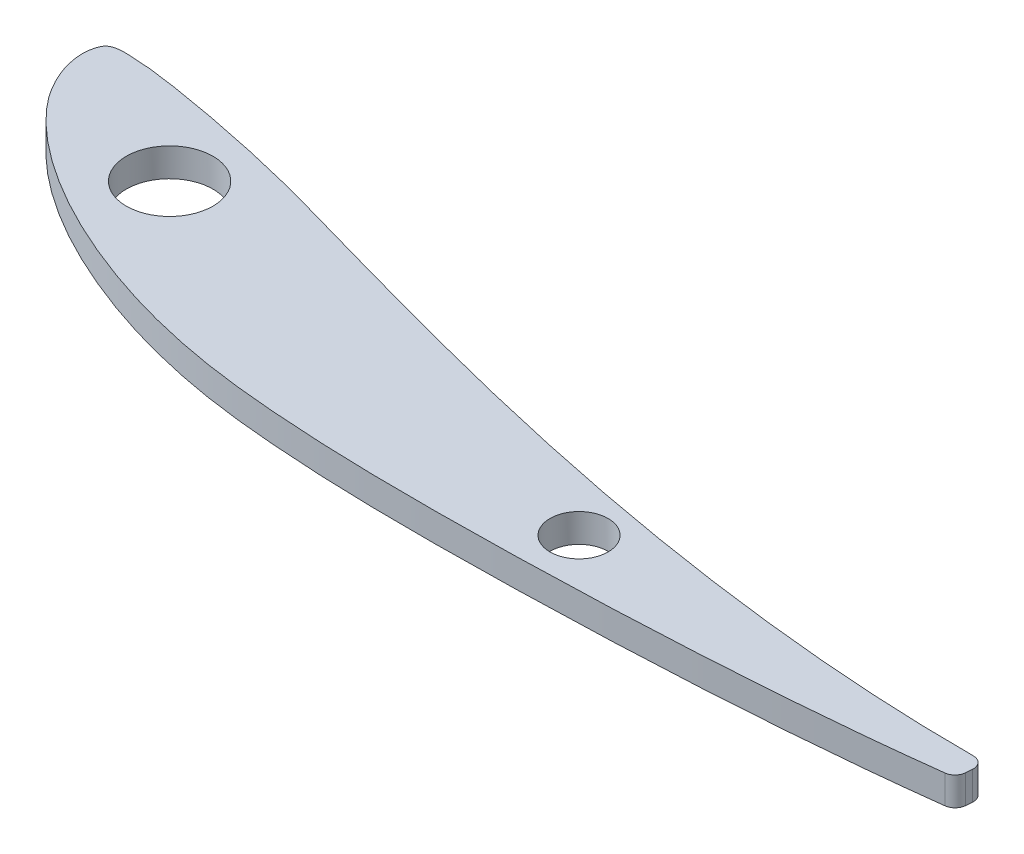
ISO-10303-21;
HEADER;
FILE_DESCRIPTION(('STEP AP214'),'2;1');
FILE_NAME('part.step','',(''),(''),'','','');
FILE_SCHEMA(('AUTOMOTIVE_DESIGN { 1 0 10303 214 1 1 1 1 }'));
ENDSEC;
DATA;
#1=APPLICATION_CONTEXT('core data for automotive mechanical design processes');
#2=APPLICATION_PROTOCOL_DEFINITION('international standard','automotive_design',2000,#1);
#3=PRODUCT_CONTEXT('',#1,'mechanical');
#4=PRODUCT('Part','Part','',(#3));
#5=PRODUCT_RELATED_PRODUCT_CATEGORY('part','',(#4));
#6=PRODUCT_DEFINITION_FORMATION('','',#4);
#7=PRODUCT_DEFINITION_CONTEXT('part definition',#1,'design');
#8=PRODUCT_DEFINITION('design','',#6,#7);
#9=PRODUCT_DEFINITION_SHAPE('','',#8);
#10=(LENGTH_UNIT() NAMED_UNIT(*) SI_UNIT(.MILLI.,.METRE.));
#11=(NAMED_UNIT(*) PLANE_ANGLE_UNIT() SI_UNIT($,.RADIAN.));
#12=(NAMED_UNIT(*) SI_UNIT($,.STERADIAN.) SOLID_ANGLE_UNIT());
#13=UNCERTAINTY_MEASURE_WITH_UNIT(LENGTH_MEASURE(1.E-05),#10,'distance_accuracy_value','');
#14=(GEOMETRIC_REPRESENTATION_CONTEXT(3) GLOBAL_UNCERTAINTY_ASSIGNED_CONTEXT((#13)) GLOBAL_UNIT_ASSIGNED_CONTEXT((#10,
#11,#12)) REPRESENTATION_CONTEXT('',''));
#15=CARTESIAN_POINT('',(0.,0.,0.));
#16=DIRECTION('',(0.,0.,1.));
#17=DIRECTION('',(1.,0.,0.));
#18=AXIS2_PLACEMENT_3D('',#15,#16,#17);
#19=CARTESIAN_POINT('',(298.857811710705,-3.175,26.1466705308497));
#20=CARTESIAN_POINT('',(298.856662639227,-3.175,26.1387486127703));
#21=CARTESIAN_POINT('',(297.633641763924,-3.175,26.8219907764441));
#22=CARTESIAN_POINT('',(296.285509348852,-3.175,27.4848303285165));
#23=CARTESIAN_POINT('',(292.777465742433,-3.175,29.1955452424968));
#24=CARTESIAN_POINT('',(288.067262994317,-3.175,30.965858612294));
#25=CARTESIAN_POINT('',(281.523729362366,-3.175,32.7786639593878));
#26=CARTESIAN_POINT('',(273.586904679442,-3.175,34.3198196124686));
#27=CARTESIAN_POINT('',(264.347464534687,-3.175,35.6013061847425));
#28=CARTESIAN_POINT('',(253.981328037305,-3.175,36.5347789245492));
#29=CARTESIAN_POINT('',(242.613491300924,-3.175,37.0696136369673));
#30=CARTESIAN_POINT('',(230.394070318636,-3.175,37.1746289440018));
#31=CARTESIAN_POINT('',(217.471223612421,-3.175,36.817831575187));
#32=CARTESIAN_POINT('',(204.00040499071,-3.175,36.0028417205393));
#33=CARTESIAN_POINT('',(190.136234506896,-3.175,34.734731771219));
#34=CARTESIAN_POINT('',(176.033094201207,-3.175,33.0310289768294));
#35=CARTESIAN_POINT('',(161.842177889675,-3.175,30.9308773504015));
#36=CARTESIAN_POINT('',(147.709569870829,-3.175,28.4811699518312));
#37=CARTESIAN_POINT('',(133.775408695098,-3.175,25.7258340138646));
#38=CARTESIAN_POINT('',(120.166596154891,-3.175,22.7451125567506));
#39=CARTESIAN_POINT('',(107.002388597573,-3.175,19.6016587809557));
#40=CARTESIAN_POINT('',(94.3913890188312,-3.175,16.3781680679727));
#41=CARTESIAN_POINT('',(82.426724302167,-3.175,13.153699812273));
#42=CARTESIAN_POINT('',(71.1905675935346,-3.175,10.0172968631099));
#43=CARTESIAN_POINT('',(60.7469216680835,-3.175,7.06407770107094));
#44=CARTESIAN_POINT('',(51.1432282225789,-3.175,4.34985818630684));
#45=CARTESIAN_POINT('',(42.3121182332758,-3.175,2.08320161733037));
#46=CARTESIAN_POINT('',(34.2060105984926,-3.175,0.305666429048975));
#47=CARTESIAN_POINT('',(26.845350388862,-3.175,-1.1710387440897));
#48=CARTESIAN_POINT('',(20.2679325078176,-3.175,-2.36154408345908));
#49=CARTESIAN_POINT('',(14.5403990580808,-3.175,-3.24605787013261));
#50=CARTESIAN_POINT('',(9.7317270132722,-3.175,-3.87481671702589));
#51=CARTESIAN_POINT('',(5.88176139509885,-3.175,-4.07429049382323));
#52=CARTESIAN_POINT('',(3.06391313462618,-3.175,-4.17950180857045));
#53=CARTESIAN_POINT('',(0.890615184890498,-3.175,-3.36857270625188));
#54=CARTESIAN_POINT('',(0.154946107578894,-3.175,-1.41757276692397));
#55=CARTESIAN_POINT('',(-0.130342445316775,-3.175,0.754680535623404));
#56=CARTESIAN_POINT('',(0.138551362685966,-3.175,3.37590152826943));
#57=CARTESIAN_POINT('',(0.930948930580319,-3.175,6.2594594460146));
#58=CARTESIAN_POINT('',(2.29077278895608,-3.175,9.34230385255906));
#59=CARTESIAN_POINT('',(4.21521710859019,-3.175,12.5570256672961));
#60=CARTESIAN_POINT('',(6.80111556019376,-3.175,15.8180664482998));
#61=CARTESIAN_POINT('',(10.0371891967718,-3.175,19.0981540919776));
#62=CARTESIAN_POINT('',(13.8699187618189,-3.175,22.425351247697));
#63=CARTESIAN_POINT('',(18.3031030760273,-3.175,25.7365443194921));
#64=CARTESIAN_POINT('',(23.3107826573575,-3.175,28.9898365239653));
#65=CARTESIAN_POINT('',(28.8671591457748,-3.175,32.1509459904829));
#66=CARTESIAN_POINT('',(34.9583714380902,-3.175,35.1643157203585));
#67=CARTESIAN_POINT('',(41.5463841360565,-3.175,38.01333053993));
#68=CARTESIAN_POINT('',(48.6069432144938,-3.175,40.6426777346912));
#69=CARTESIAN_POINT('',(56.1125226944965,-3.175,43.0142862426201));
#70=CARTESIAN_POINT('',(64.0634961699877,-3.175,45.0329456574337));
#71=CARTESIAN_POINT('',(72.4615010084405,-3.175,46.7023747807865));
#72=CARTESIAN_POINT('',(81.3485554949356,-3.175,47.939494240616));
#73=CARTESIAN_POINT('',(90.7248966421922,-3.175,48.7815691804116));
#74=CARTESIAN_POINT('',(100.557655284705,-3.175,49.4035074954624));
#75=CARTESIAN_POINT('',(110.800813610164,-3.175,49.7521583763022));
#76=CARTESIAN_POINT('',(121.39226575484,-3.175,49.8843350093549));
#77=CARTESIAN_POINT('',(132.26824494305,-3.175,49.836744442247));
#78=CARTESIAN_POINT('',(143.348018681509,-3.175,49.6583748126657));
#79=CARTESIAN_POINT('',(154.5402761459,-3.175,49.3626781596042));
#80=CARTESIAN_POINT('',(165.750498466885,-3.175,48.9734887975663));
#81=CARTESIAN_POINT('',(176.890849421123,-3.175,48.4734800238509));
#82=CARTESIAN_POINT('',(187.881153680403,-3.175,47.8603716945151));
#83=CARTESIAN_POINT('',(198.650770602139,-3.175,47.140456046505));
#84=CARTESIAN_POINT('',(209.131260407277,-3.175,46.3045307692508));
#85=CARTESIAN_POINT('',(219.261147010518,-3.175,45.3697632158604));
#86=CARTESIAN_POINT('',(228.977405871356,-3.175,44.3332580095969));
#87=CARTESIAN_POINT('',(238.222197520758,-3.175,43.2131487687202));
#88=CARTESIAN_POINT('',(246.939229805904,-3.175,42.014429751273));
#89=CARTESIAN_POINT('',(255.076498669491,-3.175,40.7448009891469));
#90=CARTESIAN_POINT('',(262.587093356494,-3.175,39.414498489707));
#91=CARTESIAN_POINT('',(269.428915294482,-3.175,38.0380778623937));
#92=CARTESIAN_POINT('',(275.563806788414,-3.175,36.6214725517189));
#93=CARTESIAN_POINT('',(280.959330362233,-3.175,35.1787970570665));
#94=CARTESIAN_POINT('',(285.589917420702,-3.175,33.7213361574708));
#95=CARTESIAN_POINT('',(289.44651388568,-3.175,32.2742132648797));
#96=CARTESIAN_POINT('',(292.583014341972,-3.175,30.7075071466924));
#97=CARTESIAN_POINT('',(294.917442258878,-3.175,29.0857118759896));
#98=CARTESIAN_POINT('',(296.910747694994,-3.175,27.5436700032618));
#99=CARTESIAN_POINT('',(297.812683675827,-3.175,26.8008249470561));
#100=CARTESIAN_POINT('',(298.858937887118,-3.175,26.1544346059837));
#101=CARTESIAN_POINT('',(298.857811710705,-3.175,26.1466705308497));
#102=B_SPLINE_CURVE_WITH_KNOTS('',3,(#19,#20,#21,#22,#23,#24,#25,#26,#27,#28,#29,#30,#31,#32,
#33,#34,#35,#36,#37,#38,#39,#40,#41,#42,#43,#44,#45,#46,#47,#48,#49,#50,#51,#52,#53,#54,#55,#56,
#57,#58,#59,#60,#61,#62,#63,#64,#65,#66,#67,#68,#69,#70,#71,#72,#73,#74,#75,#76,#77,#78,#79,#80,
#81,#82,#83,#84,#85,#86,#87,#88,#89,#90,#91,#92,#93,#94,#95,#96,#97,#98,#99,#100,#101),
.UNSPECIFIED.,.T.,.F.,(4,1,1,1,1,1,1,1,1,1,1,1,1,1,1,1,1,1,1,1,1,1,1,1,1,1,1,1,1,1,1,1,1,1,1,1,
1,1,1,1,1,1,1,1,1,1,1,1,1,1,1,1,1,1,1,1,1,1,1,1,1,1,1,1,1,1,1,1,1,1,1,1,1,1,1,1,1,1,1,1,4),(0.,
0.000999594313299212,0.00414743475003776,0.00974820897402395,0.0180443769200241,
0.0288641783652488,0.0418307896412056,0.0567138069576779,0.0733412324180671,0.0915079886594422,
0.111021837040934,0.131661709492213,0.153207715119588,0.175433402170293,0.198110317315045,
0.221011446315139,0.243905882495844,0.266573311035611,0.288810349135398,0.310405035997316,
0.331177743204304,0.350943876391454,0.369556399670184,0.386864963345299,0.402753039208367,
0.417195875784384,0.430379518903367,0.442362633174289,0.453032155511853,0.462284345612072,
0.470026206002306,0.476176644820514,0.480649947409099,0.483553073373249,0.486420689318958,
0.489953231463337,0.494096926743959,0.498850588304447,0.504196750280792,0.510125492183598,
0.516691031253851,0.524011699263473,0.532092122465354,0.540897920896839,0.550403413935838,
0.56058104089174,0.571396483088815,0.582828080950064,0.594829641292505,0.607347037120814,
0.620384325080165,0.633968936607918,0.648199967415963,0.663193936825189,0.678898580785939,
0.695226562400326,0.712113220733955,0.729459406270428,0.747143116877991,0.765009771536014,
0.782904928287736,0.800688045055655,0.818242104849469,0.835449083117584,0.852211620697039,
0.868429578359411,0.884009362888173,0.898854951230209,0.912881826809319,0.926010749515415,
0.938166770937821,0.949289699209522,0.959322171916738,0.968216949447241,0.975948220006129,
0.982474409223121,0.987904722814407,0.992516501480522,0.996351137832237,0.999020322442866,1.),.UNSPECIFIED.);
#103=DIRECTION('',(0.,1.,0.));
#104=VECTOR('',#103,1.);
#105=SURFACE_OF_LINEAR_EXTRUSION('',#102,#104);
#106=CARTESIAN_POINT('',(234.888546097097,-3.175,37.1125924363226));
#107=VERTEX_POINT('',#106);
#108=CARTESIAN_POINT('',(235.085796786395,-3.175,43.5852742181098));
#109=VERTEX_POINT('',#108);
#110=EDGE_CURVE('E97',#107,#109,#102,.T.);
#111=ORIENTED_EDGE('',*,*,#110,.T.);
#112=DIRECTION('',(0.,1.,0.));
#113=VECTOR('',#112,1.);
#114=CARTESIAN_POINT('',(235.085796786395,-3.175,43.5852742181098));
#115=LINE('',#114,#113);
#116=CARTESIAN_POINT('',(235.085796786395,3.175,43.5852742181098));
#117=VERTEX_POINT('',#116);
#118=EDGE_CURVE('E59',#109,#117,#115,.T.);
#119=ORIENTED_EDGE('',*,*,#118,.T.);
#120=CARTESIAN_POINT('',(298.857811710705,3.175,26.1466705308497));
#121=CARTESIAN_POINT('',(298.856662639227,3.175,26.1387486127703));
#122=CARTESIAN_POINT('',(297.633641763924,3.175,26.8219907764441));
#123=CARTESIAN_POINT('',(296.285509348852,3.175,27.4848303285165));
#124=CARTESIAN_POINT('',(292.777465742433,3.175,29.1955452424968));
#125=CARTESIAN_POINT('',(288.067262994317,3.175,30.965858612294));
#126=CARTESIAN_POINT('',(281.523729362366,3.175,32.7786639593878));
#127=CARTESIAN_POINT('',(273.586904679442,3.175,34.3198196124686));
#128=CARTESIAN_POINT('',(264.347464534687,3.175,35.6013061847425));
#129=CARTESIAN_POINT('',(253.981328037305,3.175,36.5347789245492));
#130=CARTESIAN_POINT('',(242.613491300924,3.175,37.0696136369673));
#131=CARTESIAN_POINT('',(230.394070318636,3.175,37.1746289440018));
#132=CARTESIAN_POINT('',(217.471223612421,3.175,36.817831575187));
#133=CARTESIAN_POINT('',(204.00040499071,3.175,36.0028417205393));
#134=CARTESIAN_POINT('',(190.136234506896,3.175,34.734731771219));
#135=CARTESIAN_POINT('',(176.033094201207,3.175,33.0310289768294));
#136=CARTESIAN_POINT('',(161.842177889675,3.175,30.9308773504015));
#137=CARTESIAN_POINT('',(147.709569870829,3.175,28.4811699518312));
#138=CARTESIAN_POINT('',(133.775408695098,3.175,25.7258340138646));
#139=CARTESIAN_POINT('',(120.166596154891,3.175,22.7451125567506));
#140=CARTESIAN_POINT('',(107.002388597573,3.175,19.6016587809557));
#141=CARTESIAN_POINT('',(94.3913890188312,3.175,16.3781680679727));
#142=CARTESIAN_POINT('',(82.426724302167,3.175,13.153699812273));
#143=CARTESIAN_POINT('',(71.1905675935346,3.175,10.0172968631099));
#144=CARTESIAN_POINT('',(60.7469216680835,3.175,7.06407770107094));
#145=CARTESIAN_POINT('',(51.1432282225789,3.175,4.34985818630684));
#146=CARTESIAN_POINT('',(42.3121182332758,3.175,2.08320161733037));
#147=CARTESIAN_POINT('',(34.2060105984926,3.175,0.305666429048975));
#148=CARTESIAN_POINT('',(26.845350388862,3.175,-1.1710387440897));
#149=CARTESIAN_POINT('',(20.2679325078176,3.175,-2.36154408345908));
#150=CARTESIAN_POINT('',(14.5403990580808,3.175,-3.24605787013261));
#151=CARTESIAN_POINT('',(9.7317270132722,3.175,-3.87481671702589));
#152=CARTESIAN_POINT('',(5.88176139509885,3.175,-4.07429049382323));
#153=CARTESIAN_POINT('',(3.06391313462618,3.175,-4.17950180857045));
#154=CARTESIAN_POINT('',(0.890615184890498,3.175,-3.36857270625188));
#155=CARTESIAN_POINT('',(0.154946107578894,3.175,-1.41757276692397));
#156=CARTESIAN_POINT('',(-0.130342445316775,3.175,0.754680535623404));
#157=CARTESIAN_POINT('',(0.138551362685966,3.175,3.37590152826943));
#158=CARTESIAN_POINT('',(0.930948930580319,3.175,6.2594594460146));
#159=CARTESIAN_POINT('',(2.29077278895608,3.175,9.34230385255906));
#160=CARTESIAN_POINT('',(4.21521710859019,3.175,12.5570256672961));
#161=CARTESIAN_POINT('',(6.80111556019376,3.175,15.8180664482998));
#162=CARTESIAN_POINT('',(10.0371891967718,3.175,19.0981540919776));
#163=CARTESIAN_POINT('',(13.8699187618189,3.175,22.425351247697));
#164=CARTESIAN_POINT('',(18.3031030760273,3.175,25.7365443194921));
#165=CARTESIAN_POINT('',(23.3107826573575,3.175,28.9898365239653));
#166=CARTESIAN_POINT('',(28.8671591457748,3.175,32.1509459904829));
#167=CARTESIAN_POINT('',(34.9583714380902,3.175,35.1643157203585));
#168=CARTESIAN_POINT('',(41.5463841360565,3.175,38.01333053993));
#169=CARTESIAN_POINT('',(48.6069432144938,3.175,40.6426777346912));
#170=CARTESIAN_POINT('',(56.1125226944965,3.175,43.0142862426201));
#171=CARTESIAN_POINT('',(64.0634961699877,3.175,45.0329456574337));
#172=CARTESIAN_POINT('',(72.4615010084405,3.175,46.7023747807865));
#173=CARTESIAN_POINT('',(81.3485554949356,3.175,47.939494240616));
#174=CARTESIAN_POINT('',(90.7248966421922,3.175,48.7815691804116));
#175=CARTESIAN_POINT('',(100.557655284705,3.175,49.4035074954624));
#176=CARTESIAN_POINT('',(110.800813610164,3.175,49.7521583763022));
#177=CARTESIAN_POINT('',(121.39226575484,3.175,49.8843350093549));
#178=CARTESIAN_POINT('',(132.26824494305,3.175,49.836744442247));
#179=CARTESIAN_POINT('',(143.348018681509,3.175,49.6583748126657));
#180=CARTESIAN_POINT('',(154.5402761459,3.175,49.3626781596042));
#181=CARTESIAN_POINT('',(165.750498466885,3.175,48.9734887975663));
#182=CARTESIAN_POINT('',(176.890849421123,3.175,48.4734800238509));
#183=CARTESIAN_POINT('',(187.881153680403,3.175,47.8603716945151));
#184=CARTESIAN_POINT('',(198.650770602139,3.175,47.140456046505));
#185=CARTESIAN_POINT('',(209.131260407277,3.175,46.3045307692508));
#186=CARTESIAN_POINT('',(219.261147010518,3.175,45.3697632158604));
#187=CARTESIAN_POINT('',(228.977405871356,3.175,44.3332580095969));
#188=CARTESIAN_POINT('',(238.222197520758,3.175,43.2131487687202));
#189=CARTESIAN_POINT('',(246.939229805904,3.175,42.014429751273));
#190=CARTESIAN_POINT('',(255.076498669491,3.175,40.7448009891469));
#191=CARTESIAN_POINT('',(262.587093356494,3.175,39.414498489707));
#192=CARTESIAN_POINT('',(269.428915294482,3.175,38.0380778623937));
#193=CARTESIAN_POINT('',(275.563806788414,3.175,36.6214725517189));
#194=CARTESIAN_POINT('',(280.959330362233,3.175,35.1787970570665));
#195=CARTESIAN_POINT('',(285.589917420702,3.175,33.7213361574708));
#196=CARTESIAN_POINT('',(289.44651388568,3.175,32.2742132648797));
#197=CARTESIAN_POINT('',(292.583014341972,3.175,30.7075071466924));
#198=CARTESIAN_POINT('',(294.917442258878,3.175,29.0857118759896));
#199=CARTESIAN_POINT('',(296.910747694994,3.175,27.5436700032618));
#200=CARTESIAN_POINT('',(297.812683675827,3.175,26.8008249470561));
#201=CARTESIAN_POINT('',(298.858937887118,3.175,26.1544346059837));
#202=CARTESIAN_POINT('',(298.857811710705,3.175,26.1466705308497));
#203=B_SPLINE_CURVE_WITH_KNOTS('',3,(#120,#121,#122,#123,#124,#125,#126,#127,#128,#129,#130,
#131,#132,#133,#134,#135,#136,#137,#138,#139,#140,#141,#142,#143,#144,#145,#146,#147,#148,#149,
#150,#151,#152,#153,#154,#155,#156,#157,#158,#159,#160,#161,#162,#163,#164,#165,#166,#167,#168,
#169,#170,#171,#172,#173,#174,#175,#176,#177,#178,#179,#180,#181,#182,#183,#184,#185,#186,#187,
#188,#189,#190,#191,#192,#193,#194,#195,#196,#197,#198,#199,#200,#201,#202),.UNSPECIFIED.,.T.,
.F.,(4,1,1,1,1,1,1,1,1,1,1,1,1,1,1,1,1,1,1,1,1,1,1,1,1,1,1,1,1,1,1,1,1,1,1,1,1,1,1,1,1,1,1,1,1,
1,1,1,1,1,1,1,1,1,1,1,1,1,1,1,1,1,1,1,1,1,1,1,1,1,1,1,1,1,1,1,1,1,1,1,4),(0.,
0.000999594313299212,0.00414743475003776,0.00974820897402395,0.0180443769200241,
0.0288641783652488,0.0418307896412056,0.0567138069576779,0.0733412324180671,0.0915079886594422,
0.111021837040934,0.131661709492213,0.153207715119588,0.175433402170293,0.198110317315045,
0.221011446315139,0.243905882495844,0.266573311035611,0.288810349135398,0.310405035997316,
0.331177743204304,0.350943876391454,0.369556399670184,0.386864963345299,0.402753039208367,
0.417195875784384,0.430379518903367,0.442362633174289,0.453032155511853,0.462284345612072,
0.470026206002306,0.476176644820514,0.480649947409099,0.483553073373249,0.486420689318958,
0.489953231463337,0.494096926743959,0.498850588304447,0.504196750280792,0.510125492183598,
0.516691031253851,0.524011699263473,0.532092122465354,0.540897920896839,0.550403413935838,
0.56058104089174,0.571396483088815,0.582828080950064,0.594829641292505,0.607347037120814,
0.620384325080165,0.633968936607918,0.648199967415963,0.663193936825189,0.678898580785939,
0.695226562400326,0.712113220733955,0.729459406270428,0.747143116877991,0.765009771536014,
0.782904928287736,0.800688045055655,0.818242104849469,0.835449083117584,0.852211620697039,
0.868429578359411,0.884009362888173,0.898854951230209,0.912881826809319,0.926010749515415,
0.938166770937821,0.949289699209522,0.959322171916738,0.968216949447241,0.975948220006129,
0.982474409223121,0.987904722814407,0.992516501480522,0.996351137832237,0.999020322442866,1.),.UNSPECIFIED.);
#204=CARTESIAN_POINT('',(234.888546097097,3.175,37.1125924363226));
#205=VERTEX_POINT('',#204);
#206=EDGE_CURVE('E85',#205,#117,#203,.T.);
#207=ORIENTED_EDGE('',*,*,#206,.F.);
#208=DIRECTION('',(0.,1.,0.));
#209=VECTOR('',#208,1.);
#210=CARTESIAN_POINT('',(234.888546097097,3.175,37.1125924363226));
#211=LINE('',#210,#209);
#212=EDGE_CURVE('E107',#205,#107,#211,.F.);
#213=ORIENTED_EDGE('',*,*,#212,.T.);
#214=EDGE_LOOP('',(#111,#119,#207,#213));
#215=FACE_BOUND('',#214,.T.);
#216=ADVANCED_FACE('F42',(#215),#105,.T.);
#217=CARTESIAN_POINT('',(1.21378296363023,-3.175,6.7945660189772));
#218=DIRECTION('',(0.,-1.,0.));
#219=DIRECTION('',(0.,0.,-1.));
#220=AXIS2_PLACEMENT_3D('',#217,#218,#219);
#221=PLANE('',#220);
#222=CARTESIAN_POINT('',(34.3178055312473,-3.175,15.7509308778717));
#223=DIRECTION('',(0.,1.,0.));
#224=DIRECTION('',(0.,0.,1.));
#225=AXIS2_PLACEMENT_3D('',#222,#223,#224);
#226=CIRCLE('',#225,9.652);
#227=CARTESIAN_POINT('',(34.3178055312473,-3.175,25.4029308778717));
#228=VERTEX_POINT('',#227);
#229=EDGE_CURVE('E112',#228,#228,#226,.T.);
#230=ORIENTED_EDGE('',*,*,#229,.T.);
#231=EDGE_LOOP('',(#230));
#232=FACE_BOUND('',#231,.T.);
#233=CARTESIAN_POINT('',(148.341148856815,-3.175,38.4751927329829));
#234=DIRECTION('',(0.,1.,0.));
#235=DIRECTION('',(0.,0.,1.));
#236=AXIS2_PLACEMENT_3D('',#233,#234,#235);
#237=CIRCLE('',#236,6.47700000000001);
#238=CARTESIAN_POINT('',(148.341148856815,-3.175,44.9521927329829));
#239=VERTEX_POINT('',#238);
#240=EDGE_CURVE('E118',#239,#239,#237,.T.);
#241=ORIENTED_EDGE('',*,*,#240,.T.);
#242=EDGE_LOOP('',(#241));
#243=FACE_BOUND('',#242,.T.);
#244=DIRECTION('',(-0.0871557427476507,0.,0.996194698091746));
#245=VECTOR('',#244,1.);
#246=CARTESIAN_POINT('',(231.503607585663,-3.175,107.587328596347));
#247=LINE('',#246,#245);
#248=CARTESIAN_POINT('',(237.427760363049,-3.175,39.8739525012687));
#249=VERTEX_POINT('',#248);
#250=CARTESIAN_POINT('',(237.304233394772,-3.175,41.2858722094773));
#251=VERTEX_POINT('',#250);
#252=EDGE_CURVE('E116',#249,#251,#247,.T.);
#253=ORIENTED_EDGE('',*,*,#252,.T.);
#254=CARTESIAN_POINT('',(234.773898861619,-3.175,41.0644966228983));
#255=DIRECTION('',(0.,-1.,0.));
#256=DIRECTION('',(0.,0.,-1.));
#257=AXIS2_PLACEMENT_3D('',#254,#255,#256);
#258=CIRCLE('',#257,2.54);
#259=EDGE_CURVE('E100',#251,#109,#258,.T.);
#260=ORIENTED_EDGE('',*,*,#259,.T.);
#261=ORIENTED_EDGE('',*,*,#110,.F.);
#262=CARTESIAN_POINT('',(234.897425829896,-3.175,39.6525769146897));
#263=DIRECTION('',(0.,-1.,0.));
#264=DIRECTION('',(0.,0.,-1.));
#265=AXIS2_PLACEMENT_3D('',#262,#263,#264);
#266=CIRCLE('',#265,2.54);
#267=EDGE_CURVE('E101',#107,#249,#266,.T.);
#268=ORIENTED_EDGE('',*,*,#267,.T.);
#269=EDGE_LOOP('',(#253,#260,#261,#268));
#270=FACE_BOUND('',#269,.T.);
#271=ADVANCED_FACE('F141',(#232,#243,#270),#221,.T.);
#272=CARTESIAN_POINT('',(1.21378296363023,3.175,6.7945660189772));
#273=DIRECTION('',(0.,-1.,0.));
#274=DIRECTION('',(0.,0.,-1.));
#275=AXIS2_PLACEMENT_3D('',#272,#273,#274);
#276=PLANE('',#275);
#277=CARTESIAN_POINT('',(34.3178055312473,3.175,15.7509308778717));
#278=DIRECTION('',(0.,-1.,0.));
#279=DIRECTION('',(0.,0.,-1.));
#280=AXIS2_PLACEMENT_3D('',#277,#278,#279);
#281=CIRCLE('',#280,9.652);
#282=CARTESIAN_POINT('',(34.3178055312473,3.175,6.09893087787165));
#283=VERTEX_POINT('',#282);
#284=EDGE_CURVE('E46',#283,#283,#281,.T.);
#285=ORIENTED_EDGE('',*,*,#284,.T.);
#286=EDGE_LOOP('',(#285));
#287=FACE_BOUND('',#286,.T.);
#288=CARTESIAN_POINT('',(148.341148856815,3.175,38.4751927329829));
#289=DIRECTION('',(0.,-1.,0.));
#290=DIRECTION('',(0.,0.,-1.));
#291=AXIS2_PLACEMENT_3D('',#288,#289,#290);
#292=CIRCLE('',#291,6.47700000000001);
#293=CARTESIAN_POINT('',(148.341148856815,3.175,31.9981927329829));
#294=VERTEX_POINT('',#293);
#295=EDGE_CURVE('E110',#294,#294,#292,.T.);
#296=ORIENTED_EDGE('',*,*,#295,.T.);
#297=EDGE_LOOP('',(#296));
#298=FACE_BOUND('',#297,.T.);
#299=ORIENTED_EDGE('',*,*,#206,.T.);
#300=CARTESIAN_POINT('',(234.773898861619,3.175,41.0644966228983));
#301=DIRECTION('',(0.,-1.,0.));
#302=DIRECTION('',(0.,0.,-1.));
#303=AXIS2_PLACEMENT_3D('',#300,#301,#302);
#304=CIRCLE('',#303,2.54);
#305=CARTESIAN_POINT('',(237.304233394772,3.175,41.2858722094773));
#306=VERTEX_POINT('',#305);
#307=EDGE_CURVE('E11',#117,#306,#304,.F.);
#308=ORIENTED_EDGE('',*,*,#307,.T.);
#309=DIRECTION('',(0.0871557427476507,0.,-0.996194698091746));
#310=VECTOR('',#309,1.);
#311=CARTESIAN_POINT('',(238.505537410234,3.175,27.5549044812305));
#312=LINE('',#311,#310);
#313=CARTESIAN_POINT('',(237.427760363049,3.175,39.8739525012687));
#314=VERTEX_POINT('',#313);
#315=EDGE_CURVE('E84',#306,#314,#312,.T.);
#316=ORIENTED_EDGE('',*,*,#315,.T.);
#317=CARTESIAN_POINT('',(234.897425829896,3.175,39.6525769146897));
#318=DIRECTION('',(0.,-1.,0.));
#319=DIRECTION('',(0.,0.,-1.));
#320=AXIS2_PLACEMENT_3D('',#317,#318,#319);
#321=CIRCLE('',#320,2.54);
#322=EDGE_CURVE('E51',#314,#205,#321,.F.);
#323=ORIENTED_EDGE('',*,*,#322,.T.);
#324=EDGE_LOOP('',(#299,#308,#316,#323));
#325=FACE_BOUND('',#324,.T.);
#326=ADVANCED_FACE('F83',(#287,#298,#325),#276,.F.);
#327=CARTESIAN_POINT('',(231.503607585663,-3.175,107.587328596347));
#328=DIRECTION('',(-0.996194698091746,0.,-0.0871557427476507));
#329=DIRECTION('',(-0.0871557427476507,0.,0.996194698091746));
#330=AXIS2_PLACEMENT_3D('',#327,#328,#329);
#331=PLANE('',#330);
#332=ORIENTED_EDGE('',*,*,#315,.F.);
#333=DIRECTION('',(0.,-1.,0.));
#334=VECTOR('',#333,1.);
#335=CARTESIAN_POINT('',(237.304233394772,-3.175,41.2858722094773));
#336=LINE('',#335,#334);
#337=EDGE_CURVE('E93',#306,#251,#336,.T.);
#338=ORIENTED_EDGE('',*,*,#337,.T.);
#339=ORIENTED_EDGE('',*,*,#252,.F.);
#340=DIRECTION('',(0.,-1.,0.));
#341=VECTOR('',#340,1.);
#342=CARTESIAN_POINT('',(237.427760363049,3.175,39.8739525012687));
#343=LINE('',#342,#341);
#344=EDGE_CURVE('E96',#249,#314,#343,.F.);
#345=ORIENTED_EDGE('',*,*,#344,.T.);
#346=EDGE_LOOP('',(#332,#338,#339,#345));
#347=FACE_BOUND('',#346,.T.);
#348=ADVANCED_FACE('F91',(#347),#331,.F.);
#349=CARTESIAN_POINT('',(234.773898861619,0.,41.0644966228983));
#350=DIRECTION('',(0.,1.,0.));
#351=DIRECTION('',(0.,0.,1.));
#352=AXIS2_PLACEMENT_3D('',#349,#350,#351);
#353=CYLINDRICAL_SURFACE('',#352,2.54);
#354=ORIENTED_EDGE('',*,*,#307,.F.);
#355=ORIENTED_EDGE('',*,*,#118,.F.);
#356=ORIENTED_EDGE('',*,*,#259,.F.);
#357=ORIENTED_EDGE('',*,*,#337,.F.);
#358=EDGE_LOOP('',(#354,#355,#356,#357));
#359=FACE_BOUND('',#358,.T.);
#360=ADVANCED_FACE('F99',(#359),#353,.T.);
#361=CARTESIAN_POINT('',(234.897425829896,0.,39.6525769146897));
#362=DIRECTION('',(0.,1.,0.));
#363=DIRECTION('',(0.,0.,1.));
#364=AXIS2_PLACEMENT_3D('',#361,#362,#363);
#365=CYLINDRICAL_SURFACE('',#364,2.54);
#366=ORIENTED_EDGE('',*,*,#267,.F.);
#367=ORIENTED_EDGE('',*,*,#212,.F.);
#368=ORIENTED_EDGE('',*,*,#322,.F.);
#369=ORIENTED_EDGE('',*,*,#344,.F.);
#370=EDGE_LOOP('',(#366,#367,#368,#369));
#371=FACE_BOUND('',#370,.T.);
#372=ADVANCED_FACE('F44',(#371),#365,.T.);
#373=CARTESIAN_POINT('',(148.341148856815,-3.175,38.4751927329829));
#374=DIRECTION('',(0.,1.,0.));
#375=DIRECTION('',(0.,0.,1.));
#376=AXIS2_PLACEMENT_3D('',#373,#374,#375);
#377=CYLINDRICAL_SURFACE('',#376,6.47700000000001);
#378=ORIENTED_EDGE('',*,*,#240,.F.);
#379=EDGE_LOOP('',(#378));
#380=FACE_BOUND('',#379,.T.);
#381=ORIENTED_EDGE('',*,*,#295,.F.);
#382=EDGE_LOOP('',(#381));
#383=FACE_BOUND('',#382,.T.);
#384=ADVANCED_FACE('F148',(#380,#383),#377,.F.);
#385=CARTESIAN_POINT('',(34.3178055312473,-3.175,15.7509308778717));
#386=DIRECTION('',(0.,1.,0.));
#387=DIRECTION('',(0.,0.,1.));
#388=AXIS2_PLACEMENT_3D('',#385,#386,#387);
#389=CYLINDRICAL_SURFACE('',#388,9.652);
#390=ORIENTED_EDGE('',*,*,#229,.F.);
#391=EDGE_LOOP('',(#390));
#392=FACE_BOUND('',#391,.T.);
#393=ORIENTED_EDGE('',*,*,#284,.F.);
#394=EDGE_LOOP('',(#393));
#395=FACE_BOUND('',#394,.T.);
#396=ADVANCED_FACE('F158',(#392,#395),#389,.F.);
#397=CLOSED_SHELL('',(#216,#271,#326,#348,#360,#372,#384,#396));
#398=MANIFOLD_SOLID_BREP('B2',#397);
#399=ADVANCED_BREP_SHAPE_REPRESENTATION('',(#18,#398),#14);
#400=SHAPE_DEFINITION_REPRESENTATION(#9,#399);
ENDSEC;
END-ISO-10303-21;
